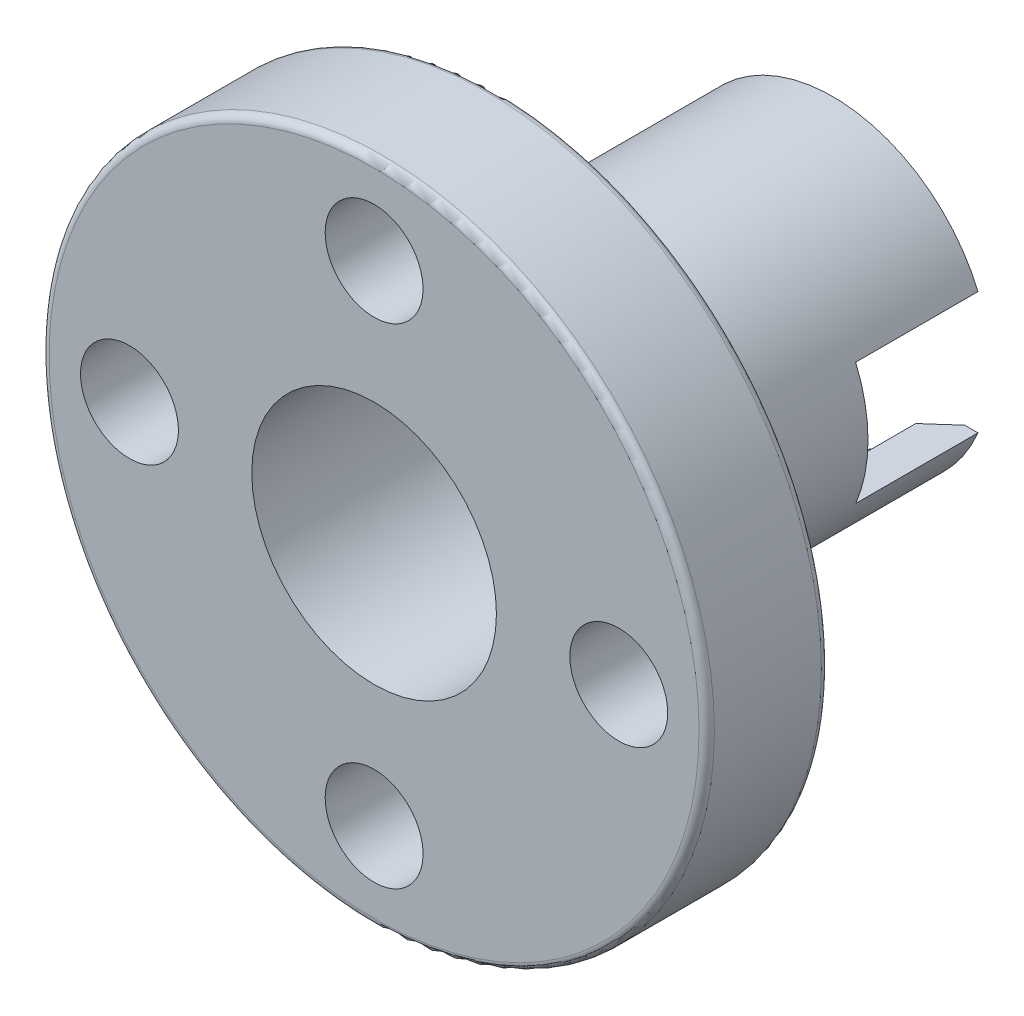
ISO-10303-21;
HEADER;
FILE_DESCRIPTION(('STEP AP214'),'2;1');
FILE_NAME('part.step','',(''),(''),'','','');
FILE_SCHEMA(('AUTOMOTIVE_DESIGN { 1 0 10303 214 1 1 1 1 }'));
ENDSEC;
DATA;
#1=APPLICATION_CONTEXT('core data for automotive mechanical design processes');
#2=APPLICATION_PROTOCOL_DEFINITION('international standard','automotive_design',2000,#1);
#3=PRODUCT_CONTEXT('',#1,'mechanical');
#4=PRODUCT('Part','Part','',(#3));
#5=PRODUCT_RELATED_PRODUCT_CATEGORY('part','',(#4));
#6=PRODUCT_DEFINITION_FORMATION('','',#4);
#7=PRODUCT_DEFINITION_CONTEXT('part definition',#1,'design');
#8=PRODUCT_DEFINITION('design','',#6,#7);
#9=PRODUCT_DEFINITION_SHAPE('','',#8);
#10=(LENGTH_UNIT() NAMED_UNIT(*) SI_UNIT(.MILLI.,.METRE.));
#11=(NAMED_UNIT(*) PLANE_ANGLE_UNIT() SI_UNIT($,.RADIAN.));
#12=(NAMED_UNIT(*) SI_UNIT($,.STERADIAN.) SOLID_ANGLE_UNIT());
#13=UNCERTAINTY_MEASURE_WITH_UNIT(LENGTH_MEASURE(1.E-05),#10,'distance_accuracy_value','');
#14=(GEOMETRIC_REPRESENTATION_CONTEXT(3) GLOBAL_UNCERTAINTY_ASSIGNED_CONTEXT((#13)) GLOBAL_UNIT_ASSIGNED_CONTEXT((#10,
#11,#12)) REPRESENTATION_CONTEXT('',''));
#15=CARTESIAN_POINT('',(0.,0.,0.));
#16=DIRECTION('',(0.,0.,1.));
#17=DIRECTION('',(1.,0.,0.));
#18=AXIS2_PLACEMENT_3D('',#15,#16,#17);
#19=CARTESIAN_POINT('',(-5.15,0.,-15.));
#20=DIRECTION('',(0.,0.,-1.));
#21=DIRECTION('',(-1.,0.,0.));
#22=AXIS2_PLACEMENT_3D('',#19,#20,#21);
#23=PLANE('',#22);
#24=DIRECTION('',(1.,0.,0.));
#25=VECTOR('',#24,1.);
#26=CARTESIAN_POINT('',(-10.875,-2.,-15.));
#27=LINE('',#26,#25);
#28=CARTESIAN_POINT('',(-4.74578760586691,-2.,-15.));
#29=VERTEX_POINT('',#28);
#30=CARTESIAN_POINT('',(-4.30842198490354,-2.,-15.));
#31=VERTEX_POINT('',#30);
#32=EDGE_CURVE('E124',#29,#31,#27,.T.);
#33=ORIENTED_EDGE('',*,*,#32,.T.);
#34=CARTESIAN_POINT('',(0.,0.,-15.));
#35=DIRECTION('',(0.,0.,-1.));
#36=DIRECTION('',(-1.,0.,0.));
#37=AXIS2_PLACEMENT_3D('',#34,#35,#36);
#38=CIRCLE('',#37,4.75000000000001);
#39=CARTESIAN_POINT('',(4.30842198490354,-2.,-15.));
#40=VERTEX_POINT('',#39);
#41=EDGE_CURVE('E50',#31,#40,#38,.F.);
#42=ORIENTED_EDGE('',*,*,#41,.T.);
#43=CARTESIAN_POINT('',(4.74578760586691,-2.,-15.));
#44=VERTEX_POINT('',#43);
#45=EDGE_CURVE('E290',#40,#44,#27,.T.);
#46=ORIENTED_EDGE('',*,*,#45,.T.);
#47=CARTESIAN_POINT('',(0.,0.,-15.));
#48=DIRECTION('',(0.,0.,-1.));
#49=DIRECTION('',(-1.,0.,0.));
#50=AXIS2_PLACEMENT_3D('',#47,#48,#49);
#51=CIRCLE('',#50,5.15);
#52=EDGE_CURVE('E141',#44,#29,#51,.T.);
#53=ORIENTED_EDGE('',*,*,#52,.T.);
#54=EDGE_LOOP('',(#33,#42,#46,#53));
#55=FACE_BOUND('',#54,.T.);
#56=ADVANCED_FACE('F35',(#55),#23,.T.);
#57=CARTESIAN_POINT('',(0.,0.,0.));
#58=DIRECTION('',(0.,0.,1.));
#59=DIRECTION('',(1.,0.,0.));
#60=AXIS2_PLACEMENT_3D('',#57,#58,#59);
#61=PLANE('',#60);
#62=CARTESIAN_POINT('',(0.,0.,0.));
#63=DIRECTION('',(0.,0.,1.));
#64=DIRECTION('',(1.,0.,0.));
#65=AXIS2_PLACEMENT_3D('',#62,#63,#64);
#66=CIRCLE('',#65,10.625);
#67=CARTESIAN_POINT('',(10.625,0.,0.));
#68=VERTEX_POINT('',#67);
#69=EDGE_CURVE('E11',#68,#68,#66,.T.);
#70=ORIENTED_EDGE('',*,*,#69,.T.);
#71=EDGE_LOOP('',(#70));
#72=FACE_BOUND('',#71,.T.);
#73=CARTESIAN_POINT('',(0.,8.,0.));
#74=DIRECTION('',(0.,0.,-1.));
#75=DIRECTION('',(-1.,0.,0.));
#76=AXIS2_PLACEMENT_3D('',#73,#74,#75);
#77=CIRCLE('',#76,1.6);
#78=CARTESIAN_POINT('',(-1.6,8.,0.));
#79=VERTEX_POINT('',#78);
#80=EDGE_CURVE('E275',#79,#79,#77,.T.);
#81=ORIENTED_EDGE('',*,*,#80,.T.);
#82=EDGE_LOOP('',(#81));
#83=FACE_BOUND('',#82,.T.);
#84=CARTESIAN_POINT('',(-8.00000000000025,2.47572467311813E-13,0.));
#85=DIRECTION('',(0.,0.,-1.));
#86=DIRECTION('',(-1.,0.,0.));
#87=AXIS2_PLACEMENT_3D('',#84,#85,#86);
#88=CIRCLE('',#87,1.6);
#89=CARTESIAN_POINT('',(-9.60000000000025,2.47572467311813E-13,0.));
#90=VERTEX_POINT('',#89);
#91=EDGE_CURVE('E271',#90,#90,#88,.T.);
#92=ORIENTED_EDGE('',*,*,#91,.T.);
#93=EDGE_LOOP('',(#92));
#94=FACE_BOUND('',#93,.T.);
#95=CARTESIAN_POINT('',(-4.95144934623626E-13,-8.,0.));
#96=DIRECTION('',(0.,0.,-1.));
#97=DIRECTION('',(-1.,0.,0.));
#98=AXIS2_PLACEMENT_3D('',#95,#96,#97);
#99=CIRCLE('',#98,1.6);
#100=CARTESIAN_POINT('',(-1.6000000000005,-8.,0.));
#101=VERTEX_POINT('',#100);
#102=EDGE_CURVE('E267',#101,#101,#99,.T.);
#103=ORIENTED_EDGE('',*,*,#102,.T.);
#104=EDGE_LOOP('',(#103));
#105=FACE_BOUND('',#104,.T.);
#106=CARTESIAN_POINT('',(7.99999999999975,-2.48552184751131E-13,0.));
#107=DIRECTION('',(0.,0.,-1.));
#108=DIRECTION('',(-1.,0.,0.));
#109=AXIS2_PLACEMENT_3D('',#106,#107,#108);
#110=CIRCLE('',#109,1.6);
#111=CARTESIAN_POINT('',(6.39999999999976,-2.48552184751131E-13,0.));
#112=VERTEX_POINT('',#111);
#113=EDGE_CURVE('E259',#112,#112,#110,.T.);
#114=ORIENTED_EDGE('',*,*,#113,.T.);
#115=EDGE_LOOP('',(#114));
#116=FACE_BOUND('',#115,.T.);
#117=CARTESIAN_POINT('',(0.,0.,0.));
#118=DIRECTION('',(0.,0.,-1.));
#119=DIRECTION('',(-1.,0.,0.));
#120=AXIS2_PLACEMENT_3D('',#117,#118,#119);
#121=CIRCLE('',#120,4.);
#122=CARTESIAN_POINT('',(-4.,0.,0.));
#123=VERTEX_POINT('',#122);
#124=EDGE_CURVE('E147',#123,#123,#121,.T.);
#125=ORIENTED_EDGE('',*,*,#124,.T.);
#126=EDGE_LOOP('',(#125));
#127=FACE_BOUND('',#126,.T.);
#128=ADVANCED_FACE('F316',(#72,#83,#94,#105,#116,#127),#61,.T.);
#129=CARTESIAN_POINT('',(0.,0.,-15.));
#130=DIRECTION('',(0.,0.,-1.));
#131=DIRECTION('',(-1.,0.,0.));
#132=AXIS2_PLACEMENT_3D('',#129,#130,#131);
#133=CYLINDRICAL_SURFACE('',#132,10.875);
#134=CARTESIAN_POINT('',(0.,0.,-3.75));
#135=DIRECTION('',(0.,0.,-1.));
#136=DIRECTION('',(-1.,0.,0.));
#137=AXIS2_PLACEMENT_3D('',#134,#135,#136);
#138=CIRCLE('',#137,10.875);
#139=CARTESIAN_POINT('',(-10.875,0.,-3.75));
#140=VERTEX_POINT('',#139);
#141=EDGE_CURVE('E43',#140,#140,#138,.F.);
#142=ORIENTED_EDGE('',*,*,#141,.T.);
#143=EDGE_LOOP('',(#142));
#144=FACE_BOUND('',#143,.T.);
#145=CARTESIAN_POINT('',(0.,0.,-0.249999999999999));
#146=DIRECTION('',(0.,0.,1.));
#147=DIRECTION('',(1.,0.,0.));
#148=AXIS2_PLACEMENT_3D('',#145,#146,#147);
#149=CIRCLE('',#148,10.875);
#150=CARTESIAN_POINT('',(10.875,0.,-0.249999999999997));
#151=VERTEX_POINT('',#150);
#152=EDGE_CURVE('E223',#151,#151,#149,.F.);
#153=ORIENTED_EDGE('',*,*,#152,.T.);
#154=EDGE_LOOP('',(#153));
#155=FACE_BOUND('',#154,.T.);
#156=ADVANCED_FACE('F228',(#144,#155),#133,.T.);
#157=CARTESIAN_POINT('',(-10.875,0.,-4.));
#158=DIRECTION('',(0.,0.,-1.));
#159=DIRECTION('',(-1.,0.,0.));
#160=AXIS2_PLACEMENT_3D('',#157,#158,#159);
#161=PLANE('',#160);
#162=CARTESIAN_POINT('',(0.,0.,-4.));
#163=DIRECTION('',(0.,0.,-1.));
#164=DIRECTION('',(-1.,0.,0.));
#165=AXIS2_PLACEMENT_3D('',#162,#163,#164);
#166=CIRCLE('',#165,10.625);
#167=CARTESIAN_POINT('',(-10.625,0.,-4.));
#168=VERTEX_POINT('',#167);
#169=EDGE_CURVE('E220',#168,#168,#166,.T.);
#170=ORIENTED_EDGE('',*,*,#169,.T.);
#171=EDGE_LOOP('',(#170));
#172=FACE_BOUND('',#171,.T.);
#173=CARTESIAN_POINT('',(0.,0.,-4.));
#174=DIRECTION('',(0.,0.,-1.));
#175=DIRECTION('',(-1.,0.,0.));
#176=AXIS2_PLACEMENT_3D('',#173,#174,#175);
#177=CIRCLE('',#176,5.65);
#178=CARTESIAN_POINT('',(-5.65,0.,-4.));
#179=VERTEX_POINT('',#178);
#180=EDGE_CURVE('E217',#179,#179,#177,.F.);
#181=ORIENTED_EDGE('',*,*,#180,.T.);
#182=EDGE_LOOP('',(#181));
#183=FACE_BOUND('',#182,.T.);
#184=CARTESIAN_POINT('',(0.,8.,-4.));
#185=DIRECTION('',(0.,0.,-1.));
#186=DIRECTION('',(-1.,0.,0.));
#187=AXIS2_PLACEMENT_3D('',#184,#185,#186);
#188=CIRCLE('',#187,1.6);
#189=CARTESIAN_POINT('',(-1.6,8.,-4.));
#190=VERTEX_POINT('',#189);
#191=EDGE_CURVE('E246',#190,#190,#188,.T.);
#192=ORIENTED_EDGE('',*,*,#191,.F.);
#193=EDGE_LOOP('',(#192));
#194=FACE_BOUND('',#193,.T.);
#195=CARTESIAN_POINT('',(-8.00000000000025,2.47572467311813E-13,-4.));
#196=DIRECTION('',(0.,0.,-1.));
#197=DIRECTION('',(-1.,0.,0.));
#198=AXIS2_PLACEMENT_3D('',#195,#196,#197);
#199=CIRCLE('',#198,1.6);
#200=CARTESIAN_POINT('',(-9.60000000000025,2.47572467311813E-13,-4.));
#201=VERTEX_POINT('',#200);
#202=EDGE_CURVE('E250',#201,#201,#199,.T.);
#203=ORIENTED_EDGE('',*,*,#202,.F.);
#204=EDGE_LOOP('',(#203));
#205=FACE_BOUND('',#204,.T.);
#206=CARTESIAN_POINT('',(-4.94682341696699E-13,-8.,-4.));
#207=DIRECTION('',(0.,0.,-1.));
#208=DIRECTION('',(-1.,0.,0.));
#209=AXIS2_PLACEMENT_3D('',#206,#207,#208);
#210=CIRCLE('',#209,1.6);
#211=CARTESIAN_POINT('',(-1.60000000000049,-8.,-4.));
#212=VERTEX_POINT('',#211);
#213=EDGE_CURVE('E254',#212,#212,#210,.T.);
#214=ORIENTED_EDGE('',*,*,#213,.F.);
#215=EDGE_LOOP('',(#214));
#216=FACE_BOUND('',#215,.T.);
#217=CARTESIAN_POINT('',(7.99999999999975,-2.48552184751131E-13,-4.));
#218=DIRECTION('',(0.,0.,-1.));
#219=DIRECTION('',(-1.,0.,0.));
#220=AXIS2_PLACEMENT_3D('',#217,#218,#219);
#221=CIRCLE('',#220,1.6);
#222=CARTESIAN_POINT('',(6.39999999999976,-2.48552184751131E-13,-4.));
#223=VERTEX_POINT('',#222);
#224=EDGE_CURVE('E257',#223,#223,#221,.T.);
#225=ORIENTED_EDGE('',*,*,#224,.F.);
#226=EDGE_LOOP('',(#225));
#227=FACE_BOUND('',#226,.T.);
#228=ADVANCED_FACE('F237',(#172,#183,#194,#205,#216,#227),#161,.T.);
#229=CARTESIAN_POINT('',(0.,0.,-15.));
#230=DIRECTION('',(0.,0.,-1.));
#231=DIRECTION('',(-1.,0.,0.));
#232=AXIS2_PLACEMENT_3D('',#229,#230,#231);
#233=CYLINDRICAL_SURFACE('',#232,5.15);
#234=CARTESIAN_POINT('',(0.,0.,-4.5));
#235=DIRECTION('',(0.,0.,-1.));
#236=DIRECTION('',(-1.,0.,0.));
#237=AXIS2_PLACEMENT_3D('',#234,#235,#236);
#238=CIRCLE('',#237,5.15);
#239=CARTESIAN_POINT('',(-5.15,0.,-4.5));
#240=VERTEX_POINT('',#239);
#241=EDGE_CURVE('E214',#240,#240,#238,.T.);
#242=ORIENTED_EDGE('',*,*,#241,.T.);
#243=EDGE_LOOP('',(#242));
#244=FACE_BOUND('',#243,.T.);
#245=DIRECTION('',(0.,0.,-1.));
#246=VECTOR('',#245,1.);
#247=CARTESIAN_POINT('',(4.74578760586691,-2.,-15.));
#248=LINE('',#247,#246);
#249=CARTESIAN_POINT('',(4.74578760586691,-2.,-11.));
#250=VERTEX_POINT('',#249);
#251=EDGE_CURVE('E263',#250,#44,#248,.T.);
#252=ORIENTED_EDGE('',*,*,#251,.F.);
#253=CARTESIAN_POINT('',(0.,0.,-11.));
#254=DIRECTION('',(0.,0.,1.));
#255=DIRECTION('',(1.,0.,0.));
#256=AXIS2_PLACEMENT_3D('',#253,#254,#255);
#257=CIRCLE('',#256,5.15);
#258=CARTESIAN_POINT('',(4.74578760586691,2.,-11.));
#259=VERTEX_POINT('',#258);
#260=EDGE_CURVE('E282',#259,#250,#257,.F.);
#261=ORIENTED_EDGE('',*,*,#260,.F.);
#262=DIRECTION('',(0.,0.,-1.));
#263=VECTOR('',#262,1.);
#264=CARTESIAN_POINT('',(4.74578760586691,2.,-15.));
#265=LINE('',#264,#263);
#266=CARTESIAN_POINT('',(4.74578760586691,2.,-15.));
#267=VERTEX_POINT('',#266);
#268=EDGE_CURVE('E123',#267,#259,#265,.F.);
#269=ORIENTED_EDGE('',*,*,#268,.F.);
#270=CARTESIAN_POINT('',(-4.74578760586691,2.,-15.));
#271=VERTEX_POINT('',#270);
#272=EDGE_CURVE('E130',#271,#267,#51,.T.);
#273=ORIENTED_EDGE('',*,*,#272,.F.);
#274=DIRECTION('',(0.,0.,-1.));
#275=VECTOR('',#274,1.);
#276=CARTESIAN_POINT('',(-4.74578760586691,2.,-15.));
#277=LINE('',#276,#275);
#278=CARTESIAN_POINT('',(-4.74578760586691,2.,-11.));
#279=VERTEX_POINT('',#278);
#280=EDGE_CURVE('E113',#279,#271,#277,.T.);
#281=ORIENTED_EDGE('',*,*,#280,.F.);
#282=CARTESIAN_POINT('',(-4.74578760586691,-2.,-11.));
#283=VERTEX_POINT('',#282);
#284=EDGE_CURVE('E280',#283,#279,#257,.F.);
#285=ORIENTED_EDGE('',*,*,#284,.F.);
#286=DIRECTION('',(0.,0.,-1.));
#287=VECTOR('',#286,1.);
#288=CARTESIAN_POINT('',(-4.74578760586691,-2.,-15.));
#289=LINE('',#288,#287);
#290=EDGE_CURVE('E260',#29,#283,#289,.F.);
#291=ORIENTED_EDGE('',*,*,#290,.F.);
#292=ORIENTED_EDGE('',*,*,#52,.F.);
#293=EDGE_LOOP('',(#252,#261,#269,#273,#281,#285,#291,#292));
#294=FACE_BOUND('',#293,.T.);
#295=ADVANCED_FACE('F138',(#244,#294),#233,.T.);
#296=DIRECTION('',(1.,0.,0.));
#297=VECTOR('',#296,1.);
#298=CARTESIAN_POINT('',(-10.875,2.,-15.));
#299=LINE('',#298,#297);
#300=CARTESIAN_POINT('',(4.30842198490354,2.,-15.));
#301=VERTEX_POINT('',#300);
#302=EDGE_CURVE('E134',#301,#267,#299,.T.);
#303=ORIENTED_EDGE('',*,*,#302,.F.);
#304=CARTESIAN_POINT('',(0.,0.,-15.));
#305=DIRECTION('',(0.,0.,-1.));
#306=DIRECTION('',(-1.,0.,0.));
#307=AXIS2_PLACEMENT_3D('',#304,#305,#306);
#308=CIRCLE('',#307,4.75000000000001);
#309=CARTESIAN_POINT('',(-4.30842198490354,2.,-15.));
#310=VERTEX_POINT('',#309);
#311=EDGE_CURVE('E132',#301,#310,#308,.F.);
#312=ORIENTED_EDGE('',*,*,#311,.T.);
#313=EDGE_CURVE('E116',#271,#310,#299,.T.);
#314=ORIENTED_EDGE('',*,*,#313,.F.);
#315=ORIENTED_EDGE('',*,*,#272,.T.);
#316=EDGE_LOOP('',(#303,#312,#314,#315));
#317=FACE_BOUND('',#316,.T.);
#318=ADVANCED_FACE('F129',(#317),#23,.T.);
#319=CARTESIAN_POINT('',(0.,0.,0.));
#320=DIRECTION('',(0.,0.,-1.));
#321=DIRECTION('',(-1.,0.,0.));
#322=AXIS2_PLACEMENT_3D('',#319,#320,#321);
#323=CYLINDRICAL_SURFACE('',#322,4.);
#324=ORIENTED_EDGE('',*,*,#124,.F.);
#325=EDGE_LOOP('',(#324));
#326=FACE_BOUND('',#325,.T.);
#327=DIRECTION('',(0.,0.,-1.));
#328=VECTOR('',#327,1.);
#329=CARTESIAN_POINT('',(3.46410161513775,-2.,0.));
#330=LINE('',#329,#328);
#331=CARTESIAN_POINT('',(3.46410161513776,-2.,-11.));
#332=VERTEX_POINT('',#331);
#333=CARTESIAN_POINT('',(3.46410161513775,-2.,-14.25));
#334=VERTEX_POINT('',#333);
#335=EDGE_CURVE('E158',#332,#334,#330,.T.);
#336=ORIENTED_EDGE('',*,*,#335,.T.);
#337=CARTESIAN_POINT('',(0.,0.,-14.25));
#338=DIRECTION('',(0.,0.,-1.));
#339=DIRECTION('',(-1.,0.,0.));
#340=AXIS2_PLACEMENT_3D('',#337,#338,#339);
#341=CIRCLE('',#340,4.);
#342=CARTESIAN_POINT('',(-3.46410161513775,-2.,-14.25));
#343=VERTEX_POINT('',#342);
#344=EDGE_CURVE('E193',#334,#343,#341,.T.);
#345=ORIENTED_EDGE('',*,*,#344,.T.);
#346=DIRECTION('',(0.,0.,-1.));
#347=VECTOR('',#346,1.);
#348=CARTESIAN_POINT('',(-3.46410161513775,-2.,0.));
#349=LINE('',#348,#347);
#350=CARTESIAN_POINT('',(-3.46410161513775,-2.,-11.));
#351=VERTEX_POINT('',#350);
#352=EDGE_CURVE('E153',#343,#351,#349,.F.);
#353=ORIENTED_EDGE('',*,*,#352,.T.);
#354=CARTESIAN_POINT('',(0.,0.,-11.));
#355=DIRECTION('',(0.,0.,1.));
#356=DIRECTION('',(1.,0.,0.));
#357=AXIS2_PLACEMENT_3D('',#354,#355,#356);
#358=CIRCLE('',#357,4.);
#359=CARTESIAN_POINT('',(-3.46410161513775,2.,-11.));
#360=VERTEX_POINT('',#359);
#361=EDGE_CURVE('E144',#351,#360,#358,.F.);
#362=ORIENTED_EDGE('',*,*,#361,.T.);
#363=DIRECTION('',(0.,0.,-1.));
#364=VECTOR('',#363,1.);
#365=CARTESIAN_POINT('',(-3.46410161513775,2.,0.));
#366=LINE('',#365,#364);
#367=CARTESIAN_POINT('',(-3.46410161513775,2.,-14.25));
#368=VERTEX_POINT('',#367);
#369=EDGE_CURVE('E140',#360,#368,#366,.T.);
#370=ORIENTED_EDGE('',*,*,#369,.T.);
#371=CARTESIAN_POINT('',(0.,0.,-14.25));
#372=DIRECTION('',(0.,0.,-1.));
#373=DIRECTION('',(-1.,0.,0.));
#374=AXIS2_PLACEMENT_3D('',#371,#372,#373);
#375=CIRCLE('',#374,4.);
#376=CARTESIAN_POINT('',(3.46410161513775,2.,-14.25));
#377=VERTEX_POINT('',#376);
#378=EDGE_CURVE('E161',#368,#377,#375,.T.);
#379=ORIENTED_EDGE('',*,*,#378,.T.);
#380=DIRECTION('',(0.,0.,-1.));
#381=VECTOR('',#380,1.);
#382=CARTESIAN_POINT('',(3.46410161513775,2.,0.));
#383=LINE('',#382,#381);
#384=CARTESIAN_POINT('',(3.46410161513775,2.,-11.));
#385=VERTEX_POINT('',#384);
#386=EDGE_CURVE('E156',#377,#385,#383,.F.);
#387=ORIENTED_EDGE('',*,*,#386,.T.);
#388=EDGE_CURVE('E154',#385,#332,#358,.F.);
#389=ORIENTED_EDGE('',*,*,#388,.T.);
#390=EDGE_LOOP('',(#336,#345,#353,#362,#370,#379,#387,#389));
#391=FACE_BOUND('',#390,.T.);
#392=ADVANCED_FACE('F304',(#326,#391),#323,.F.);
#393=CARTESIAN_POINT('',(7.99999999999975,-2.48552184751131E-13,0.));
#394=DIRECTION('',(0.,0.,-1.));
#395=DIRECTION('',(-1.,0.,0.));
#396=AXIS2_PLACEMENT_3D('',#393,#394,#395);
#397=CYLINDRICAL_SURFACE('',#396,1.6);
#398=ORIENTED_EDGE('',*,*,#113,.F.);
#399=EDGE_LOOP('',(#398));
#400=FACE_BOUND('',#399,.T.);
#401=ORIENTED_EDGE('',*,*,#224,.T.);
#402=EDGE_LOOP('',(#401));
#403=FACE_BOUND('',#402,.T.);
#404=ADVANCED_FACE('F331',(#400,#403),#397,.F.);
#405=CARTESIAN_POINT('',(-4.95144934623626E-13,-8.,0.));
#406=DIRECTION('',(0.,0.,-1.));
#407=DIRECTION('',(-1.,0.,0.));
#408=AXIS2_PLACEMENT_3D('',#405,#406,#407);
#409=CYLINDRICAL_SURFACE('',#408,1.6);
#410=ORIENTED_EDGE('',*,*,#102,.F.);
#411=EDGE_LOOP('',(#410));
#412=FACE_BOUND('',#411,.T.);
#413=ORIENTED_EDGE('',*,*,#213,.T.);
#414=EDGE_LOOP('',(#413));
#415=FACE_BOUND('',#414,.T.);
#416=ADVANCED_FACE('F383',(#412,#415),#409,.F.);
#417=CARTESIAN_POINT('',(-8.00000000000025,2.47572467311813E-13,0.));
#418=DIRECTION('',(0.,0.,-1.));
#419=DIRECTION('',(-1.,0.,0.));
#420=AXIS2_PLACEMENT_3D('',#417,#418,#419);
#421=CYLINDRICAL_SURFACE('',#420,1.6);
#422=ORIENTED_EDGE('',*,*,#91,.F.);
#423=EDGE_LOOP('',(#422));
#424=FACE_BOUND('',#423,.T.);
#425=ORIENTED_EDGE('',*,*,#202,.T.);
#426=EDGE_LOOP('',(#425));
#427=FACE_BOUND('',#426,.T.);
#428=ADVANCED_FACE('F388',(#424,#427),#421,.F.);
#429=CARTESIAN_POINT('',(0.,8.,0.));
#430=DIRECTION('',(0.,0.,-1.));
#431=DIRECTION('',(-1.,0.,0.));
#432=AXIS2_PLACEMENT_3D('',#429,#430,#431);
#433=CYLINDRICAL_SURFACE('',#432,1.6);
#434=ORIENTED_EDGE('',*,*,#80,.F.);
#435=EDGE_LOOP('',(#434));
#436=FACE_BOUND('',#435,.T.);
#437=ORIENTED_EDGE('',*,*,#191,.T.);
#438=EDGE_LOOP('',(#437));
#439=FACE_BOUND('',#438,.T.);
#440=ADVANCED_FACE('F185',(#436,#439),#433,.F.);
#441=CARTESIAN_POINT('',(-10.875,2.,-15.));
#442=DIRECTION('',(0.,1.,0.));
#443=DIRECTION('',(0.,0.,1.));
#444=AXIS2_PLACEMENT_3D('',#441,#442,#443);
#445=PLANE('',#444);
#446=ORIENTED_EDGE('',*,*,#313,.T.);
#447=CARTESIAN_POINT('',(-4.30842198490354,2.,-15.));
#448=CARTESIAN_POINT('',(-4.2387111805024,2.,-14.936772222459));
#449=CARTESIAN_POINT('',(-4.16886718858808,2.,-14.8736908364613));
#450=CARTESIAN_POINT('',(-4.02887273674116,2.,-14.747873715715));
#451=CARTESIAN_POINT('',(-3.95872228682709,2.,-14.6851379698164));
#452=CARTESIAN_POINT('',(-3.81806975336864,2.,-14.5600603947967));
#453=CARTESIAN_POINT('',(-3.74756766705936,2.,-14.4977185687818));
#454=CARTESIAN_POINT('',(-3.60615461818229,2.,-14.3734958857156));
#455=CARTESIAN_POINT('',(-3.53524364239982,2.,-14.3116150437125));
#456=CARTESIAN_POINT('',(-3.46410161513777,2.,-14.25));
#457=B_SPLINE_CURVE_WITH_KNOTS('',3,(#447,#448,#449,#450,#451,#452,#453,#454,#455,#456),
.UNSPECIFIED.,.F.,.F.,(4,2,2,2,4),(0.,0.28234067956171,0.564672197084542,0.847005938083883,
1.12934885539845),.UNSPECIFIED.);
#458=EDGE_CURVE('E188',#310,#368,#457,.T.);
#459=ORIENTED_EDGE('',*,*,#458,.T.);
#460=ORIENTED_EDGE('',*,*,#369,.F.);
#461=DIRECTION('',(1.,0.,0.));
#462=VECTOR('',#461,1.);
#463=CARTESIAN_POINT('',(-10.875,2.,-11.));
#464=LINE('',#463,#462);
#465=EDGE_CURVE('E119',#279,#360,#464,.T.);
#466=ORIENTED_EDGE('',*,*,#465,.F.);
#467=ORIENTED_EDGE('',*,*,#280,.T.);
#468=EDGE_LOOP('',(#446,#459,#460,#466,#467));
#469=FACE_BOUND('',#468,.T.);
#470=ADVANCED_FACE('F115',(#469),#445,.F.);
#471=CARTESIAN_POINT('',(-10.875,2.,-11.));
#472=DIRECTION('',(0.,0.,1.));
#473=DIRECTION('',(1.,0.,0.));
#474=AXIS2_PLACEMENT_3D('',#471,#472,#473);
#475=PLANE('',#474);
#476=ORIENTED_EDGE('',*,*,#284,.T.);
#477=ORIENTED_EDGE('',*,*,#465,.T.);
#478=ORIENTED_EDGE('',*,*,#361,.F.);
#479=DIRECTION('',(1.,0.,0.));
#480=VECTOR('',#479,1.);
#481=CARTESIAN_POINT('',(-10.875,-2.,-11.));
#482=LINE('',#481,#480);
#483=EDGE_CURVE('E289',#283,#351,#482,.T.);
#484=ORIENTED_EDGE('',*,*,#483,.F.);
#485=EDGE_LOOP('',(#476,#477,#478,#484));
#486=FACE_BOUND('',#485,.T.);
#487=ADVANCED_FACE('F183',(#486),#475,.F.);
#488=CARTESIAN_POINT('',(-10.875,-2.,-15.));
#489=DIRECTION('',(0.,-1.,0.));
#490=DIRECTION('',(0.,0.,-1.));
#491=AXIS2_PLACEMENT_3D('',#488,#489,#490);
#492=PLANE('',#491);
#493=ORIENTED_EDGE('',*,*,#352,.F.);
#494=CARTESIAN_POINT('',(-3.46410161513775,-2.,-14.25));
#495=CARTESIAN_POINT('',(-3.53524364239981,-2.,-14.3116150437125));
#496=CARTESIAN_POINT('',(-3.60615461818228,-2.,-14.3734958857156));
#497=CARTESIAN_POINT('',(-3.74756766705936,-2.,-14.4977185687818));
#498=CARTESIAN_POINT('',(-3.81806975336864,-2.,-14.5600603947967));
#499=CARTESIAN_POINT('',(-3.95872228682709,-2.,-14.6851379698164));
#500=CARTESIAN_POINT('',(-4.02887273674116,-2.,-14.747873715715));
#501=CARTESIAN_POINT('',(-4.16886718858808,-2.,-14.8736908364613));
#502=CARTESIAN_POINT('',(-4.23871118050241,-2.,-14.936772222459));
#503=CARTESIAN_POINT('',(-4.30842198490354,-2.,-15.));
#504=B_SPLINE_CURVE_WITH_KNOTS('',3,(#494,#495,#496,#497,#498,#499,#500,#501,#502,#503),
.UNSPECIFIED.,.F.,.F.,(4,2,2,2,4),(0.,0.282342917314574,0.564676658313915,0.847008175836746,
1.12934885539846),.UNSPECIFIED.);
#505=EDGE_CURVE('E58',#343,#31,#504,.T.);
#506=ORIENTED_EDGE('',*,*,#505,.T.);
#507=ORIENTED_EDGE('',*,*,#32,.F.);
#508=ORIENTED_EDGE('',*,*,#290,.T.);
#509=ORIENTED_EDGE('',*,*,#483,.T.);
#510=EDGE_LOOP('',(#493,#506,#507,#508,#509));
#511=FACE_BOUND('',#510,.T.);
#512=ADVANCED_FACE('F204',(#511),#492,.F.);
#513=ORIENTED_EDGE('',*,*,#45,.F.);
#514=CARTESIAN_POINT('',(4.30842198490354,-2.,-15.));
#515=CARTESIAN_POINT('',(4.23871118050241,-2.,-14.936772222459));
#516=CARTESIAN_POINT('',(4.16886718858808,-2.,-14.8736908364613));
#517=CARTESIAN_POINT('',(4.02887273674116,-2.,-14.747873715715));
#518=CARTESIAN_POINT('',(3.95872228682709,-2.,-14.6851379698164));
#519=CARTESIAN_POINT('',(3.81806975336864,-2.,-14.5600603947966));
#520=CARTESIAN_POINT('',(3.74756766705936,-2.,-14.4977185687818));
#521=CARTESIAN_POINT('',(3.60615461818229,-2.,-14.3734958857156));
#522=CARTESIAN_POINT('',(3.53524364239982,-2.,-14.3116150437125));
#523=CARTESIAN_POINT('',(3.46410161513777,-2.,-14.25));
#524=B_SPLINE_CURVE_WITH_KNOTS('',3,(#514,#515,#516,#517,#518,#519,#520,#521,#522,#523),
.UNSPECIFIED.,.F.,.F.,(4,2,2,2,4),(0.,0.282340679561712,0.564672197084541,0.847005938083883,
1.12934885539845),.UNSPECIFIED.);
#525=EDGE_CURVE('E209',#40,#334,#524,.T.);
#526=ORIENTED_EDGE('',*,*,#525,.T.);
#527=ORIENTED_EDGE('',*,*,#335,.F.);
#528=EDGE_CURVE('E286',#332,#250,#482,.T.);
#529=ORIENTED_EDGE('',*,*,#528,.T.);
#530=ORIENTED_EDGE('',*,*,#251,.T.);
#531=EDGE_LOOP('',(#513,#526,#527,#529,#530));
#532=FACE_BOUND('',#531,.T.);
#533=ADVANCED_FACE('F207',(#532),#492,.F.);
#534=ORIENTED_EDGE('',*,*,#260,.T.);
#535=ORIENTED_EDGE('',*,*,#528,.F.);
#536=ORIENTED_EDGE('',*,*,#388,.F.);
#537=EDGE_CURVE('E133',#385,#259,#464,.T.);
#538=ORIENTED_EDGE('',*,*,#537,.T.);
#539=EDGE_LOOP('',(#534,#535,#536,#538));
#540=FACE_BOUND('',#539,.T.);
#541=ADVANCED_FACE('F181',(#540),#475,.F.);
#542=ORIENTED_EDGE('',*,*,#386,.F.);
#543=CARTESIAN_POINT('',(3.46410161513776,2.,-14.25));
#544=CARTESIAN_POINT('',(3.53524364239982,2.,-14.3116150437125));
#545=CARTESIAN_POINT('',(3.60615461818229,2.,-14.3734958857156));
#546=CARTESIAN_POINT('',(3.74756766705936,2.,-14.4977185687818));
#547=CARTESIAN_POINT('',(3.81806975336864,2.,-14.5600603947967));
#548=CARTESIAN_POINT('',(3.95872228682709,2.,-14.6851379698164));
#549=CARTESIAN_POINT('',(4.02887273674116,2.,-14.747873715715));
#550=CARTESIAN_POINT('',(4.16886718858809,2.,-14.8736908364613));
#551=CARTESIAN_POINT('',(4.23871118050241,2.,-14.936772222459));
#552=CARTESIAN_POINT('',(4.30842198490354,2.,-15.));
#553=B_SPLINE_CURVE_WITH_KNOTS('',3,(#543,#544,#545,#546,#547,#548,#549,#550,#551,#552),
.UNSPECIFIED.,.F.,.F.,(4,2,2,2,4),(0.,0.282342917314573,0.564676658313914,0.847008175836745,
1.12934885539845),.UNSPECIFIED.);
#554=EDGE_CURVE('E164',#377,#301,#553,.T.);
#555=ORIENTED_EDGE('',*,*,#554,.T.);
#556=ORIENTED_EDGE('',*,*,#302,.T.);
#557=ORIENTED_EDGE('',*,*,#268,.T.);
#558=ORIENTED_EDGE('',*,*,#537,.F.);
#559=EDGE_LOOP('',(#542,#555,#556,#557,#558));
#560=FACE_BOUND('',#559,.T.);
#561=ADVANCED_FACE('F176',(#560),#445,.F.);
#562=CARTESIAN_POINT('',(0.,0.,-14.25));
#563=DIRECTION('',(0.,0.,-1.));
#564=DIRECTION('',(-1.,0.,0.));
#565=AXIS2_PLACEMENT_3D('',#562,#563,#564);
#566=CONICAL_SURFACE('',#565,4.,0.785398163397452);
#567=ORIENTED_EDGE('',*,*,#458,.F.);
#568=ORIENTED_EDGE('',*,*,#311,.F.);
#569=ORIENTED_EDGE('',*,*,#554,.F.);
#570=ORIENTED_EDGE('',*,*,#378,.F.);
#571=EDGE_LOOP('',(#567,#568,#569,#570));
#572=FACE_BOUND('',#571,.T.);
#573=ADVANCED_FACE('F172',(#572),#566,.F.);
#574=CARTESIAN_POINT('',(0.,0.,-14.25));
#575=DIRECTION('',(0.,0.,-1.));
#576=DIRECTION('',(-1.,0.,0.));
#577=AXIS2_PLACEMENT_3D('',#574,#575,#576);
#578=CONICAL_SURFACE('',#577,4.,0.785398163397452);
#579=ORIENTED_EDGE('',*,*,#525,.F.);
#580=ORIENTED_EDGE('',*,*,#41,.F.);
#581=ORIENTED_EDGE('',*,*,#505,.F.);
#582=ORIENTED_EDGE('',*,*,#344,.F.);
#583=EDGE_LOOP('',(#579,#580,#581,#582));
#584=FACE_BOUND('',#583,.T.);
#585=ADVANCED_FACE('F201',(#584),#578,.F.);
#586=CARTESIAN_POINT('',(0.,0.,-4.5));
#587=DIRECTION('',(0.,0.,-1.));
#588=DIRECTION('',(-1.,0.,0.));
#589=AXIS2_PLACEMENT_3D('',#586,#587,#588);
#590=TOROIDAL_SURFACE('',#589,5.65,0.5);
#591=ORIENTED_EDGE('',*,*,#180,.F.);
#592=EDGE_LOOP('',(#591));
#593=FACE_BOUND('',#592,.T.);
#594=ORIENTED_EDGE('',*,*,#241,.F.);
#595=EDGE_LOOP('',(#594));
#596=FACE_BOUND('',#595,.T.);
#597=ADVANCED_FACE('F234',(#593,#596),#590,.F.);
#598=CARTESIAN_POINT('',(0.,0.,-3.75));
#599=DIRECTION('',(0.,0.,-1.));
#600=DIRECTION('',(-1.,0.,0.));
#601=AXIS2_PLACEMENT_3D('',#598,#599,#600);
#602=TOROIDAL_SURFACE('',#601,10.625,0.25);
#603=ORIENTED_EDGE('',*,*,#141,.F.);
#604=EDGE_LOOP('',(#603));
#605=FACE_BOUND('',#604,.T.);
#606=ORIENTED_EDGE('',*,*,#169,.F.);
#607=EDGE_LOOP('',(#606));
#608=FACE_BOUND('',#607,.T.);
#609=ADVANCED_FACE('F231',(#605,#608),#602,.T.);
#610=CARTESIAN_POINT('',(0.,0.,-0.249999999999999));
#611=DIRECTION('',(0.,0.,1.));
#612=DIRECTION('',(1.,0.,0.));
#613=AXIS2_PLACEMENT_3D('',#610,#611,#612);
#614=TOROIDAL_SURFACE('',#613,10.625,0.25);
#615=ORIENTED_EDGE('',*,*,#69,.F.);
#616=EDGE_LOOP('',(#615));
#617=FACE_BOUND('',#616,.T.);
#618=ORIENTED_EDGE('',*,*,#152,.F.);
#619=EDGE_LOOP('',(#618));
#620=FACE_BOUND('',#619,.T.);
#621=ADVANCED_FACE('F37',(#617,#620),#614,.T.);
#622=CLOSED_SHELL('',(#56,#128,#156,#228,#295,#318,#392,#404,#416,#428,#440,#470,#487,#512,#533,
#541,#561,#573,#585,#597,#609,#621));
#623=MANIFOLD_SOLID_BREP('B2',#622);
#624=ADVANCED_BREP_SHAPE_REPRESENTATION('',(#18,#623),#14);
#625=SHAPE_DEFINITION_REPRESENTATION(#9,#624);
ENDSEC;
END-ISO-10303-21;
